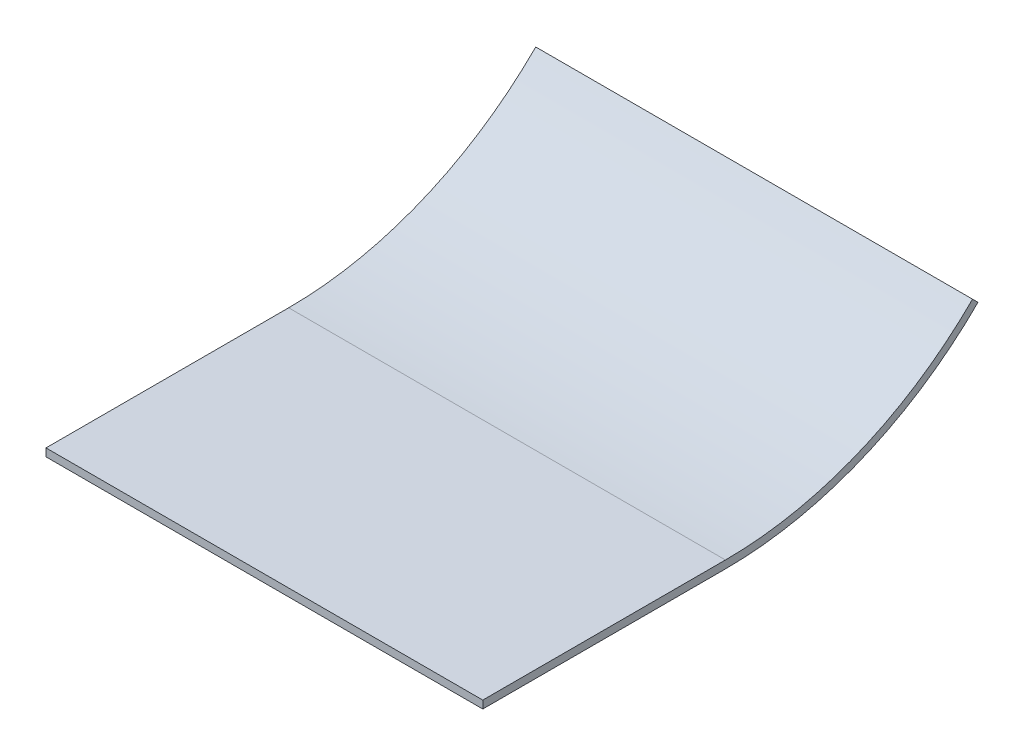
ISO-10303-21;
HEADER;
FILE_DESCRIPTION(('STEP AP214'),'2;1');
FILE_NAME('part.step','',(''),(''),'','','');
FILE_SCHEMA(('AUTOMOTIVE_DESIGN { 1 0 10303 214 1 1 1 1 }'));
ENDSEC;
DATA;
#1=APPLICATION_CONTEXT('core data for automotive mechanical design processes');
#2=APPLICATION_PROTOCOL_DEFINITION('international standard','automotive_design',2000,#1);
#3=PRODUCT_CONTEXT('',#1,'mechanical');
#4=PRODUCT('Part','Part','',(#3));
#5=PRODUCT_RELATED_PRODUCT_CATEGORY('part','',(#4));
#6=PRODUCT_DEFINITION_FORMATION('','',#4);
#7=PRODUCT_DEFINITION_CONTEXT('part definition',#1,'design');
#8=PRODUCT_DEFINITION('design','',#6,#7);
#9=PRODUCT_DEFINITION_SHAPE('','',#8);
#10=(LENGTH_UNIT() NAMED_UNIT(*) SI_UNIT(.MILLI.,.METRE.));
#11=(NAMED_UNIT(*) PLANE_ANGLE_UNIT() SI_UNIT($,.RADIAN.));
#12=(NAMED_UNIT(*) SI_UNIT($,.STERADIAN.) SOLID_ANGLE_UNIT());
#13=UNCERTAINTY_MEASURE_WITH_UNIT(LENGTH_MEASURE(1.E-05),#10,'distance_accuracy_value','');
#14=(GEOMETRIC_REPRESENTATION_CONTEXT(3) GLOBAL_UNCERTAINTY_ASSIGNED_CONTEXT((#13)) GLOBAL_UNIT_ASSIGNED_CONTEXT((#10,
#11,#12)) REPRESENTATION_CONTEXT('',''));
#15=CARTESIAN_POINT('',(0.,0.,0.));
#16=DIRECTION('',(0.,0.,1.));
#17=DIRECTION('',(1.,0.,0.));
#18=AXIS2_PLACEMENT_3D('',#15,#16,#17);
#19=CARTESIAN_POINT('',(45.,36.,-25.));
#20=DIRECTION('',(-1.,0.,0.));
#21=DIRECTION('',(0.,0.,1.));
#22=AXIS2_PLACEMENT_3D('',#19,#20,#21);
#23=CYLINDRICAL_SURFACE('',#22,36.8);
#24=CARTESIAN_POINT('',(0.,36.,-25.));
#25=DIRECTION('',(1.,0.,0.));
#26=DIRECTION('',(0.,0.,-1.));
#27=AXIS2_PLACEMENT_3D('',#24,#25,#26);
#28=CIRCLE('',#27,36.8);
#29=CARTESIAN_POINT('',(0.,-0.800000000000002,-25.));
#30=VERTEX_POINT('',#29);
#31=CARTESIAN_POINT('',(0.,9.97847045233491,-51.0215295476648));
#32=VERTEX_POINT('',#31);
#33=EDGE_CURVE('E116',#30,#32,#28,.T.);
#34=ORIENTED_EDGE('',*,*,#33,.T.);
#35=DIRECTION('',(-1.,0.,0.));
#36=VECTOR('',#35,1.);
#37=CARTESIAN_POINT('',(45.,9.97847045233491,-51.0215295476648));
#38=LINE('',#37,#36);
#39=CARTESIAN_POINT('',(45.,9.97847045233491,-51.0215295476648));
#40=VERTEX_POINT('',#39);
#41=EDGE_CURVE('E11',#40,#32,#38,.T.);
#42=ORIENTED_EDGE('',*,*,#41,.F.);
#43=CARTESIAN_POINT('',(45.,36.,-25.));
#44=DIRECTION('',(1.,0.,0.));
#45=DIRECTION('',(0.,0.,-1.));
#46=AXIS2_PLACEMENT_3D('',#43,#44,#45);
#47=CIRCLE('',#46,36.8);
#48=CARTESIAN_POINT('',(45.,-0.800000000000002,-25.));
#49=VERTEX_POINT('',#48);
#50=EDGE_CURVE('E81',#49,#40,#47,.T.);
#51=ORIENTED_EDGE('',*,*,#50,.F.);
#52=DIRECTION('',(-1.,0.,0.));
#53=VECTOR('',#52,1.);
#54=CARTESIAN_POINT('',(45.,-0.800000000000002,-25.));
#55=LINE('',#54,#53);
#56=EDGE_CURVE('E112',#49,#30,#55,.T.);
#57=ORIENTED_EDGE('',*,*,#56,.T.);
#58=EDGE_LOOP('',(#34,#42,#51,#57));
#59=FACE_BOUND('',#58,.T.);
#60=ADVANCED_FACE('F35',(#59),#23,.T.);
#61=CARTESIAN_POINT('',(45.,10.5441558772841,-50.4558441227156));
#62=DIRECTION('',(0.,0.707106781186545,-0.70710678118655));
#63=DIRECTION('',(0.,0.70710678118655,0.707106781186545));
#64=AXIS2_PLACEMENT_3D('',#61,#62,#63);
#65=PLANE('',#64);
#66=DIRECTION('',(0.,-0.70710678118655,-0.707106781186545));
#67=VECTOR('',#66,1.);
#68=CARTESIAN_POINT('',(0.,10.5441558772841,-50.4558441227156));
#69=LINE('',#68,#67);
#70=CARTESIAN_POINT('',(0.,10.5441558772841,-50.4558441227156));
#71=VERTEX_POINT('',#70);
#72=EDGE_CURVE('E119',#71,#32,#69,.T.);
#73=ORIENTED_EDGE('',*,*,#72,.F.);
#74=DIRECTION('',(-1.,0.,0.));
#75=VECTOR('',#74,1.);
#76=CARTESIAN_POINT('',(45.,10.5441558772841,-50.4558441227156));
#77=LINE('',#76,#75);
#78=CARTESIAN_POINT('',(45.,10.5441558772841,-50.4558441227156));
#79=VERTEX_POINT('',#78);
#80=EDGE_CURVE('E43',#79,#71,#77,.T.);
#81=ORIENTED_EDGE('',*,*,#80,.F.);
#82=DIRECTION('',(0.,-0.70710678118655,-0.707106781186545));
#83=VECTOR('',#82,1.);
#84=CARTESIAN_POINT('',(45.,10.5441558772841,-50.4558441227156));
#85=LINE('',#84,#83);
#86=EDGE_CURVE('E205',#79,#40,#85,.T.);
#87=ORIENTED_EDGE('',*,*,#86,.T.);
#88=ORIENTED_EDGE('',*,*,#41,.T.);
#89=EDGE_LOOP('',(#73,#81,#87,#88));
#90=FACE_BOUND('',#89,.T.);
#91=ADVANCED_FACE('F137',(#90),#65,.T.);
#92=CARTESIAN_POINT('',(45.,36.,-25.));
#93=DIRECTION('',(-1.,0.,0.));
#94=DIRECTION('',(0.,0.,1.));
#95=AXIS2_PLACEMENT_3D('',#92,#93,#94);
#96=CYLINDRICAL_SURFACE('',#95,36.);
#97=CARTESIAN_POINT('',(0.,36.,-25.));
#98=DIRECTION('',(1.,0.,0.));
#99=DIRECTION('',(0.,0.,-1.));
#100=AXIS2_PLACEMENT_3D('',#97,#98,#99);
#101=CIRCLE('',#100,36.);
#102=CARTESIAN_POINT('',(0.,0.,-25.));
#103=VERTEX_POINT('',#102);
#104=EDGE_CURVE('E122',#103,#71,#101,.T.);
#105=ORIENTED_EDGE('',*,*,#104,.F.);
#106=DIRECTION('',(-1.,0.,0.));
#107=VECTOR('',#106,1.);
#108=CARTESIAN_POINT('',(45.,0.,-25.));
#109=LINE('',#108,#107);
#110=CARTESIAN_POINT('',(45.,0.,-25.));
#111=VERTEX_POINT('',#110);
#112=EDGE_CURVE('E102',#111,#103,#109,.T.);
#113=ORIENTED_EDGE('',*,*,#112,.F.);
#114=CARTESIAN_POINT('',(45.,36.,-25.));
#115=DIRECTION('',(1.,0.,0.));
#116=DIRECTION('',(0.,0.,-1.));
#117=AXIS2_PLACEMENT_3D('',#114,#115,#116);
#118=CIRCLE('',#117,36.);
#119=EDGE_CURVE('E108',#111,#79,#118,.T.);
#120=ORIENTED_EDGE('',*,*,#119,.T.);
#121=ORIENTED_EDGE('',*,*,#80,.T.);
#122=EDGE_LOOP('',(#105,#113,#120,#121));
#123=FACE_BOUND('',#122,.T.);
#124=ADVANCED_FACE('F134',(#123),#96,.F.);
#125=CARTESIAN_POINT('',(45.,0.,0.));
#126=DIRECTION('',(0.,1.,0.));
#127=DIRECTION('',(0.,0.,1.));
#128=AXIS2_PLACEMENT_3D('',#125,#126,#127);
#129=PLANE('',#128);
#130=DIRECTION('',(0.,0.,-1.));
#131=VECTOR('',#130,1.);
#132=CARTESIAN_POINT('',(0.,0.,0.));
#133=LINE('',#132,#131);
#134=CARTESIAN_POINT('',(0.,0.,0.));
#135=VERTEX_POINT('',#134);
#136=EDGE_CURVE('E97',#135,#103,#133,.T.);
#137=ORIENTED_EDGE('',*,*,#136,.F.);
#138=DIRECTION('',(-1.,0.,0.));
#139=VECTOR('',#138,1.);
#140=CARTESIAN_POINT('',(45.,0.,0.));
#141=LINE('',#140,#139);
#142=CARTESIAN_POINT('',(45.,0.,0.));
#143=VERTEX_POINT('',#142);
#144=EDGE_CURVE('E92',#143,#135,#141,.T.);
#145=ORIENTED_EDGE('',*,*,#144,.F.);
#146=DIRECTION('',(0.,0.,-1.));
#147=VECTOR('',#146,1.);
#148=CARTESIAN_POINT('',(45.,0.,0.));
#149=LINE('',#148,#147);
#150=EDGE_CURVE('E95',#143,#111,#149,.T.);
#151=ORIENTED_EDGE('',*,*,#150,.T.);
#152=ORIENTED_EDGE('',*,*,#112,.T.);
#153=EDGE_LOOP('',(#137,#145,#151,#152));
#154=FACE_BOUND('',#153,.T.);
#155=ADVANCED_FACE('F94',(#154),#129,.T.);
#156=CARTESIAN_POINT('',(45.,-0.8,0.));
#157=DIRECTION('',(0.,0.,1.));
#158=DIRECTION('',(1.,0.,0.));
#159=AXIS2_PLACEMENT_3D('',#156,#157,#158);
#160=PLANE('',#159);
#161=DIRECTION('',(0.,1.,0.));
#162=VECTOR('',#161,1.);
#163=CARTESIAN_POINT('',(0.,-0.8,0.));
#164=LINE('',#163,#162);
#165=CARTESIAN_POINT('',(0.,-0.8,0.));
#166=VERTEX_POINT('',#165);
#167=EDGE_CURVE('E126',#166,#135,#164,.T.);
#168=ORIENTED_EDGE('',*,*,#167,.F.);
#169=DIRECTION('',(-1.,0.,0.));
#170=VECTOR('',#169,1.);
#171=CARTESIAN_POINT('',(45.,-0.8,0.));
#172=LINE('',#171,#170);
#173=CARTESIAN_POINT('',(45.,-0.8,0.));
#174=VERTEX_POINT('',#173);
#175=EDGE_CURVE('E72',#174,#166,#172,.T.);
#176=ORIENTED_EDGE('',*,*,#175,.F.);
#177=DIRECTION('',(0.,1.,0.));
#178=VECTOR('',#177,1.);
#179=CARTESIAN_POINT('',(45.,-0.8,0.));
#180=LINE('',#179,#178);
#181=EDGE_CURVE('E106',#174,#143,#180,.T.);
#182=ORIENTED_EDGE('',*,*,#181,.T.);
#183=ORIENTED_EDGE('',*,*,#144,.T.);
#184=EDGE_LOOP('',(#168,#176,#182,#183));
#185=FACE_BOUND('',#184,.T.);
#186=ADVANCED_FACE('F110',(#185),#160,.T.);
#187=CARTESIAN_POINT('',(45.,-0.8,0.));
#188=DIRECTION('',(0.,1.,0.));
#189=DIRECTION('',(0.,0.,1.));
#190=AXIS2_PLACEMENT_3D('',#187,#188,#189);
#191=PLANE('',#190);
#192=DIRECTION('',(0.,0.,-1.));
#193=VECTOR('',#192,1.);
#194=CARTESIAN_POINT('',(0.,-0.8,0.));
#195=LINE('',#194,#193);
#196=EDGE_CURVE('E75',#166,#30,#195,.T.);
#197=ORIENTED_EDGE('',*,*,#196,.T.);
#198=ORIENTED_EDGE('',*,*,#56,.F.);
#199=DIRECTION('',(0.,0.,-1.));
#200=VECTOR('',#199,1.);
#201=CARTESIAN_POINT('',(45.,-0.8,0.));
#202=LINE('',#201,#200);
#203=EDGE_CURVE('E51',#174,#49,#202,.T.);
#204=ORIENTED_EDGE('',*,*,#203,.F.);
#205=ORIENTED_EDGE('',*,*,#175,.T.);
#206=EDGE_LOOP('',(#197,#198,#204,#205));
#207=FACE_BOUND('',#206,.T.);
#208=ADVANCED_FACE('F142',(#207),#191,.F.);
#209=CARTESIAN_POINT('',(45.,36.,-25.));
#210=DIRECTION('',(1.,0.,0.));
#211=DIRECTION('',(0.,0.,-1.));
#212=AXIS2_PLACEMENT_3D('',#209,#210,#211);
#213=PLANE('',#212);
#214=ORIENTED_EDGE('',*,*,#50,.T.);
#215=ORIENTED_EDGE('',*,*,#86,.F.);
#216=ORIENTED_EDGE('',*,*,#119,.F.);
#217=ORIENTED_EDGE('',*,*,#150,.F.);
#218=ORIENTED_EDGE('',*,*,#181,.F.);
#219=ORIENTED_EDGE('',*,*,#203,.T.);
#220=EDGE_LOOP('',(#214,#215,#216,#217,#218,#219));
#221=FACE_BOUND('',#220,.T.);
#222=ADVANCED_FACE('F105',(#221),#213,.T.);
#223=CARTESIAN_POINT('',(0.,36.,-25.));
#224=DIRECTION('',(1.,0.,0.));
#225=DIRECTION('',(0.,0.,-1.));
#226=AXIS2_PLACEMENT_3D('',#223,#224,#225);
#227=PLANE('',#226);
#228=ORIENTED_EDGE('',*,*,#33,.F.);
#229=ORIENTED_EDGE('',*,*,#196,.F.);
#230=ORIENTED_EDGE('',*,*,#167,.T.);
#231=ORIENTED_EDGE('',*,*,#136,.T.);
#232=ORIENTED_EDGE('',*,*,#104,.T.);
#233=ORIENTED_EDGE('',*,*,#72,.T.);
#234=EDGE_LOOP('',(#228,#229,#230,#231,#232,#233));
#235=FACE_BOUND('',#234,.T.);
#236=ADVANCED_FACE('F140',(#235),#227,.F.);
#237=CLOSED_SHELL('',(#60,#91,#124,#155,#186,#208,#222,#236));
#238=MANIFOLD_SOLID_BREP('B2',#237);
#239=ADVANCED_BREP_SHAPE_REPRESENTATION('',(#18,#238),#14);
#240=SHAPE_DEFINITION_REPRESENTATION(#9,#239);
ENDSEC;
END-ISO-10303-21;
